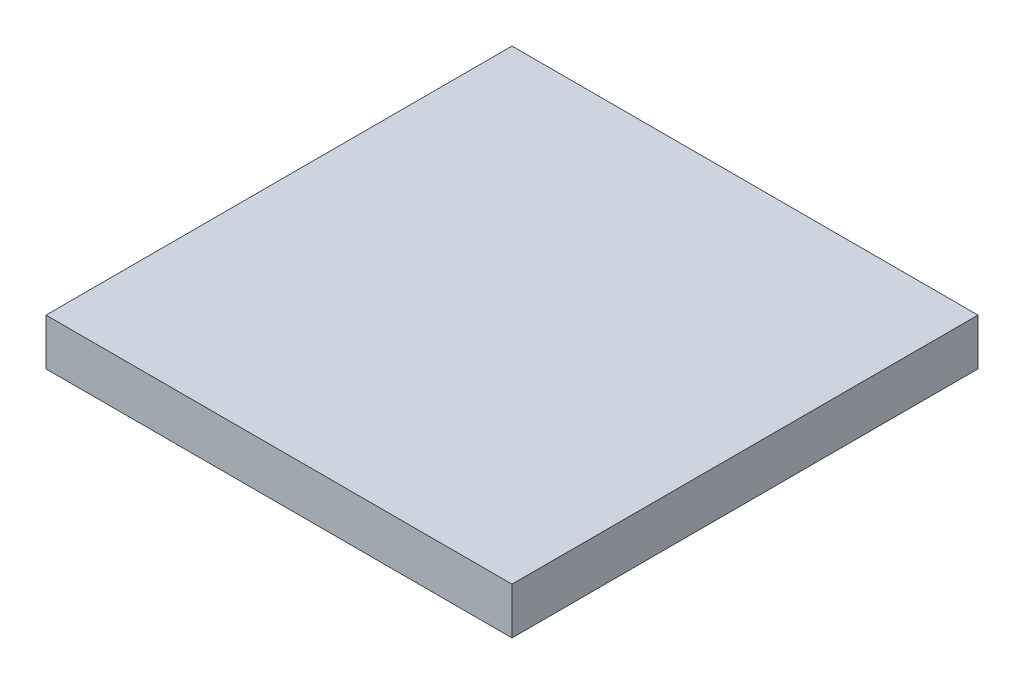
ISO-10303-21;
HEADER;
FILE_DESCRIPTION(('STEP AP214'),'2;1');
FILE_NAME('part.step','',(''),(''),'','','');
FILE_SCHEMA(('AUTOMOTIVE_DESIGN { 1 0 10303 214 1 1 1 1 }'));
ENDSEC;
DATA;
#1=APPLICATION_CONTEXT('core data for automotive mechanical design processes');
#2=APPLICATION_PROTOCOL_DEFINITION('international standard','automotive_design',2000,#1);
#3=PRODUCT_CONTEXT('',#1,'mechanical');
#4=PRODUCT('Part','Part','',(#3));
#5=PRODUCT_RELATED_PRODUCT_CATEGORY('part','',(#4));
#6=PRODUCT_DEFINITION_FORMATION('','',#4);
#7=PRODUCT_DEFINITION_CONTEXT('part definition',#1,'design');
#8=PRODUCT_DEFINITION('design','',#6,#7);
#9=PRODUCT_DEFINITION_SHAPE('','',#8);
#10=(LENGTH_UNIT() NAMED_UNIT(*) SI_UNIT(.MILLI.,.METRE.));
#11=(NAMED_UNIT(*) PLANE_ANGLE_UNIT() SI_UNIT($,.RADIAN.));
#12=(NAMED_UNIT(*) SI_UNIT($,.STERADIAN.) SOLID_ANGLE_UNIT());
#13=UNCERTAINTY_MEASURE_WITH_UNIT(LENGTH_MEASURE(1.E-05),#10,'distance_accuracy_value','');
#14=(GEOMETRIC_REPRESENTATION_CONTEXT(3) GLOBAL_UNCERTAINTY_ASSIGNED_CONTEXT((#13)) GLOBAL_UNIT_ASSIGNED_CONTEXT((#10,
#11,#12)) REPRESENTATION_CONTEXT('',''));
#15=CARTESIAN_POINT('',(0.,0.,0.));
#16=DIRECTION('',(0.,0.,1.));
#17=DIRECTION('',(1.,0.,0.));
#18=AXIS2_PLACEMENT_3D('',#15,#16,#17);
#19=CARTESIAN_POINT('',(21.,4.2,21.));
#20=DIRECTION('',(-1.,0.,0.));
#21=DIRECTION('',(0.,0.,1.));
#22=AXIS2_PLACEMENT_3D('',#19,#20,#21);
#23=PLANE('',#22);
#24=DIRECTION('',(0.,0.,-1.));
#25=VECTOR('',#24,1.);
#26=CARTESIAN_POINT('',(21.,0.,21.));
#27=LINE('',#26,#25);
#28=CARTESIAN_POINT('',(21.,0.,21.));
#29=VERTEX_POINT('',#28);
#30=CARTESIAN_POINT('',(21.,0.,-21.));
#31=VERTEX_POINT('',#30);
#32=EDGE_CURVE('E107',#29,#31,#27,.T.);
#33=ORIENTED_EDGE('',*,*,#32,.T.);
#34=DIRECTION('',(0.,-1.,0.));
#35=VECTOR('',#34,1.);
#36=CARTESIAN_POINT('',(21.,4.2,-21.));
#37=LINE('',#36,#35);
#38=CARTESIAN_POINT('',(21.,4.2,-21.));
#39=VERTEX_POINT('',#38);
#40=EDGE_CURVE('E11',#39,#31,#37,.T.);
#41=ORIENTED_EDGE('',*,*,#40,.F.);
#42=DIRECTION('',(0.,0.,-1.));
#43=VECTOR('',#42,1.);
#44=CARTESIAN_POINT('',(21.,4.2,21.));
#45=LINE('',#44,#43);
#46=CARTESIAN_POINT('',(21.,4.2,21.));
#47=VERTEX_POINT('',#46);
#48=EDGE_CURVE('E91',#47,#39,#45,.T.);
#49=ORIENTED_EDGE('',*,*,#48,.F.);
#50=DIRECTION('',(0.,-1.,0.));
#51=VECTOR('',#50,1.);
#52=CARTESIAN_POINT('',(21.,4.2,21.));
#53=LINE('',#52,#51);
#54=EDGE_CURVE('E103',#47,#29,#53,.T.);
#55=ORIENTED_EDGE('',*,*,#54,.T.);
#56=EDGE_LOOP('',(#33,#41,#49,#55));
#57=FACE_BOUND('',#56,.T.);
#58=ADVANCED_FACE('F39',(#57),#23,.F.);
#59=CARTESIAN_POINT('',(-21.,4.2,-21.));
#60=DIRECTION('',(0.,0.,1.));
#61=DIRECTION('',(1.,0.,0.));
#62=AXIS2_PLACEMENT_3D('',#59,#60,#61);
#63=PLANE('',#62);
#64=DIRECTION('',(-1.,0.,0.));
#65=VECTOR('',#64,1.);
#66=CARTESIAN_POINT('',(-21.,0.,-21.));
#67=LINE('',#66,#65);
#68=CARTESIAN_POINT('',(-21.,0.,-21.));
#69=VERTEX_POINT('',#68);
#70=EDGE_CURVE('E96',#31,#69,#67,.T.);
#71=ORIENTED_EDGE('',*,*,#70,.T.);
#72=DIRECTION('',(0.,-1.,0.));
#73=VECTOR('',#72,1.);
#74=CARTESIAN_POINT('',(-21.,4.2,-21.));
#75=LINE('',#74,#73);
#76=CARTESIAN_POINT('',(-21.,4.2,-21.));
#77=VERTEX_POINT('',#76);
#78=EDGE_CURVE('E48',#77,#69,#75,.T.);
#79=ORIENTED_EDGE('',*,*,#78,.F.);
#80=DIRECTION('',(-1.,0.,0.));
#81=VECTOR('',#80,1.);
#82=CARTESIAN_POINT('',(-21.,4.2,-21.));
#83=LINE('',#82,#81);
#84=EDGE_CURVE('E86',#39,#77,#83,.T.);
#85=ORIENTED_EDGE('',*,*,#84,.F.);
#86=ORIENTED_EDGE('',*,*,#40,.T.);
#87=EDGE_LOOP('',(#71,#79,#85,#86));
#88=FACE_BOUND('',#87,.T.);
#89=ADVANCED_FACE('F95',(#88),#63,.F.);
#90=CARTESIAN_POINT('',(-21.,4.2,21.));
#91=DIRECTION('',(1.,0.,0.));
#92=DIRECTION('',(0.,0.,-1.));
#93=AXIS2_PLACEMENT_3D('',#90,#91,#92);
#94=PLANE('',#93);
#95=DIRECTION('',(0.,0.,1.));
#96=VECTOR('',#95,1.);
#97=CARTESIAN_POINT('',(-21.,0.,21.));
#98=LINE('',#97,#96);
#99=CARTESIAN_POINT('',(-21.,0.,21.));
#100=VERTEX_POINT('',#99);
#101=EDGE_CURVE('E73',#69,#100,#98,.T.);
#102=ORIENTED_EDGE('',*,*,#101,.T.);
#103=DIRECTION('',(0.,-1.,0.));
#104=VECTOR('',#103,1.);
#105=CARTESIAN_POINT('',(-21.,4.2,21.));
#106=LINE('',#105,#104);
#107=CARTESIAN_POINT('',(-21.,4.2,21.));
#108=VERTEX_POINT('',#107);
#109=EDGE_CURVE('E98',#108,#100,#106,.T.);
#110=ORIENTED_EDGE('',*,*,#109,.F.);
#111=DIRECTION('',(0.,0.,1.));
#112=VECTOR('',#111,1.);
#113=CARTESIAN_POINT('',(-21.,4.2,21.));
#114=LINE('',#113,#112);
#115=EDGE_CURVE('E89',#77,#108,#114,.T.);
#116=ORIENTED_EDGE('',*,*,#115,.F.);
#117=ORIENTED_EDGE('',*,*,#78,.T.);
#118=EDGE_LOOP('',(#102,#110,#116,#117));
#119=FACE_BOUND('',#118,.T.);
#120=ADVANCED_FACE('F99',(#119),#94,.F.);
#121=CARTESIAN_POINT('',(-21.,4.2,21.));
#122=DIRECTION('',(0.,0.,-1.));
#123=DIRECTION('',(-1.,0.,0.));
#124=AXIS2_PLACEMENT_3D('',#121,#122,#123);
#125=PLANE('',#124);
#126=DIRECTION('',(1.,0.,0.));
#127=VECTOR('',#126,1.);
#128=CARTESIAN_POINT('',(-21.,0.,21.));
#129=LINE('',#128,#127);
#130=EDGE_CURVE('E79',#100,#29,#129,.T.);
#131=ORIENTED_EDGE('',*,*,#130,.T.);
#132=ORIENTED_EDGE('',*,*,#54,.F.);
#133=DIRECTION('',(1.,0.,0.));
#134=VECTOR('',#133,1.);
#135=CARTESIAN_POINT('',(-21.,4.2,21.));
#136=LINE('',#135,#134);
#137=EDGE_CURVE('E56',#108,#47,#136,.T.);
#138=ORIENTED_EDGE('',*,*,#137,.F.);
#139=ORIENTED_EDGE('',*,*,#109,.T.);
#140=EDGE_LOOP('',(#131,#132,#138,#139));
#141=FACE_BOUND('',#140,.T.);
#142=ADVANCED_FACE('F120',(#141),#125,.F.);
#143=CARTESIAN_POINT('',(0.,4.2,0.));
#144=DIRECTION('',(0.,-1.,0.));
#145=DIRECTION('',(0.,0.,-1.));
#146=AXIS2_PLACEMENT_3D('',#143,#144,#145);
#147=PLANE('',#146);
#148=ORIENTED_EDGE('',*,*,#48,.T.);
#149=ORIENTED_EDGE('',*,*,#84,.T.);
#150=ORIENTED_EDGE('',*,*,#115,.T.);
#151=ORIENTED_EDGE('',*,*,#137,.T.);
#152=EDGE_LOOP('',(#148,#149,#150,#151));
#153=FACE_BOUND('',#152,.T.);
#154=ADVANCED_FACE('F87',(#153),#147,.F.);
#155=CARTESIAN_POINT('',(0.,0.,0.));
#156=DIRECTION('',(0.,-1.,0.));
#157=DIRECTION('',(0.,0.,-1.));
#158=AXIS2_PLACEMENT_3D('',#155,#156,#157);
#159=PLANE('',#158);
#160=ORIENTED_EDGE('',*,*,#32,.F.);
#161=ORIENTED_EDGE('',*,*,#130,.F.);
#162=ORIENTED_EDGE('',*,*,#101,.F.);
#163=ORIENTED_EDGE('',*,*,#70,.F.);
#164=EDGE_LOOP('',(#160,#161,#162,#163));
#165=FACE_BOUND('',#164,.T.);
#166=ADVANCED_FACE('F123',(#165),#159,.T.);
#167=CLOSED_SHELL('',(#58,#89,#120,#142,#154,#166));
#168=MANIFOLD_SOLID_BREP('B2',#167);
#169=ADVANCED_BREP_SHAPE_REPRESENTATION('',(#18,#168),#14);
#170=SHAPE_DEFINITION_REPRESENTATION(#9,#169);
ENDSEC;
END-ISO-10303-21;
